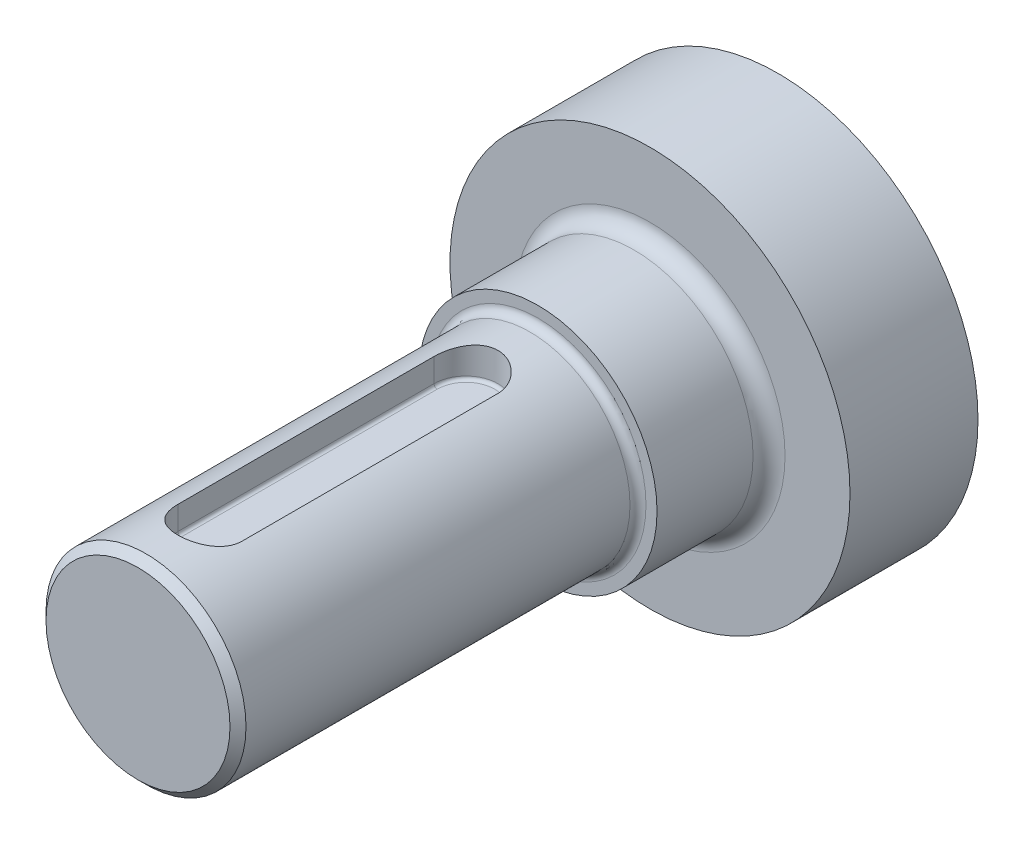
ISO-10303-21;
HEADER;
FILE_DESCRIPTION(('STEP AP214'),'2;1');
FILE_NAME('part.step','',(''),(''),'','','');
FILE_SCHEMA(('AUTOMOTIVE_DESIGN { 1 0 10303 214 1 1 1 1 }'));
ENDSEC;
DATA;
#1=APPLICATION_CONTEXT('core data for automotive mechanical design processes');
#2=APPLICATION_PROTOCOL_DEFINITION('international standard','automotive_design',2000,#1);
#3=PRODUCT_CONTEXT('',#1,'mechanical');
#4=PRODUCT('Part','Part','',(#3));
#5=PRODUCT_RELATED_PRODUCT_CATEGORY('part','',(#4));
#6=PRODUCT_DEFINITION_FORMATION('','',#4);
#7=PRODUCT_DEFINITION_CONTEXT('part definition',#1,'design');
#8=PRODUCT_DEFINITION('design','',#6,#7);
#9=PRODUCT_DEFINITION_SHAPE('','',#8);
#10=(LENGTH_UNIT() NAMED_UNIT(*) SI_UNIT(.MILLI.,.METRE.));
#11=(NAMED_UNIT(*) PLANE_ANGLE_UNIT() SI_UNIT($,.RADIAN.));
#12=(NAMED_UNIT(*) SI_UNIT($,.STERADIAN.) SOLID_ANGLE_UNIT());
#13=UNCERTAINTY_MEASURE_WITH_UNIT(LENGTH_MEASURE(1.E-05),#10,'distance_accuracy_value','');
#14=(GEOMETRIC_REPRESENTATION_CONTEXT(3) GLOBAL_UNCERTAINTY_ASSIGNED_CONTEXT((#13)) GLOBAL_UNIT_ASSIGNED_CONTEXT((#10,
#11,#12)) REPRESENTATION_CONTEXT('',''));
#15=CARTESIAN_POINT('',(0.,0.,0.));
#16=DIRECTION('',(0.,0.,1.));
#17=DIRECTION('',(1.,0.,0.));
#18=AXIS2_PLACEMENT_3D('',#15,#16,#17);
#19=CARTESIAN_POINT('',(0.,0.,-30.));
#20=DIRECTION('',(0.,0.,1.));
#21=DIRECTION('',(1.,0.,0.));
#22=AXIS2_PLACEMENT_3D('',#19,#20,#21);
#23=PLANE('',#22);
#24=CARTESIAN_POINT('',(0.,0.,-30.));
#25=DIRECTION('',(0.,0.,1.));
#26=DIRECTION('',(1.,0.,0.));
#27=AXIS2_PLACEMENT_3D('',#24,#25,#26);
#28=CIRCLE('',#27,25.);
#29=CARTESIAN_POINT('',(25.,0.,-30.));
#30=VERTEX_POINT('',#29);
#31=EDGE_CURVE('E19',#30,#30,#28,.T.);
#32=ORIENTED_EDGE('',*,*,#31,.F.);
#33=EDGE_LOOP('',(#32));
#34=FACE_BOUND('',#33,.T.);
#35=ADVANCED_FACE('F15',(#34),#23,.F.);
#36=CARTESIAN_POINT('',(0.,0.,-30.));
#37=DIRECTION('',(0.,0.,1.));
#38=DIRECTION('',(1.,0.,0.));
#39=AXIS2_PLACEMENT_3D('',#36,#37,#38);
#40=CYLINDRICAL_SURFACE('',#39,25.);
#41=ORIENTED_EDGE('',*,*,#31,.T.);
#42=EDGE_LOOP('',(#41));
#43=FACE_BOUND('',#42,.T.);
#44=CARTESIAN_POINT('',(0.,0.,-14.));
#45=DIRECTION('',(0.,0.,1.));
#46=DIRECTION('',(1.,0.,0.));
#47=AXIS2_PLACEMENT_3D('',#44,#45,#46);
#48=CIRCLE('',#47,25.);
#49=CARTESIAN_POINT('',(25.,0.,-14.));
#50=VERTEX_POINT('',#49);
#51=EDGE_CURVE('E198',#50,#50,#48,.T.);
#52=ORIENTED_EDGE('',*,*,#51,.F.);
#53=EDGE_LOOP('',(#52));
#54=FACE_BOUND('',#53,.T.);
#55=ADVANCED_FACE('F213',(#43,#54),#40,.T.);
#56=CARTESIAN_POINT('',(0.,0.,-14.));
#57=DIRECTION('',(0.,0.,1.));
#58=DIRECTION('',(1.,0.,0.));
#59=AXIS2_PLACEMENT_3D('',#56,#57,#58);
#60=PLANE('',#59);
#61=ORIENTED_EDGE('',*,*,#51,.T.);
#62=EDGE_LOOP('',(#61));
#63=FACE_BOUND('',#62,.T.);
#64=CARTESIAN_POINT('',(0.,0.,-14.));
#65=DIRECTION('',(0.,0.,1.));
#66=DIRECTION('',(1.,0.,0.));
#67=AXIS2_PLACEMENT_3D('',#64,#65,#66);
#68=CIRCLE('',#67,16.88);
#69=CARTESIAN_POINT('',(16.88,0.,-14.));
#70=VERTEX_POINT('',#69);
#71=EDGE_CURVE('E195',#70,#70,#68,.F.);
#72=ORIENTED_EDGE('',*,*,#71,.T.);
#73=EDGE_LOOP('',(#72));
#74=FACE_BOUND('',#73,.T.);
#75=ADVANCED_FACE('F221',(#63,#74),#60,.T.);
#76=CARTESIAN_POINT('',(0.,0.,-12.));
#77=DIRECTION('',(0.,0.,1.));
#78=DIRECTION('',(1.,0.,0.));
#79=AXIS2_PLACEMENT_3D('',#76,#77,#78);
#80=TOROIDAL_SURFACE('',#79,16.88,2.);
#81=CARTESIAN_POINT('',(0.,0.,-12.));
#82=DIRECTION('',(0.,0.,1.));
#83=DIRECTION('',(1.,0.,0.));
#84=AXIS2_PLACEMENT_3D('',#81,#82,#83);
#85=CIRCLE('',#84,14.88);
#86=CARTESIAN_POINT('',(14.88,0.,-12.));
#87=VERTEX_POINT('',#86);
#88=EDGE_CURVE('E191',#87,#87,#85,.T.);
#89=ORIENTED_EDGE('',*,*,#88,.F.);
#90=EDGE_LOOP('',(#89));
#91=FACE_BOUND('',#90,.T.);
#92=ORIENTED_EDGE('',*,*,#71,.F.);
#93=EDGE_LOOP('',(#92));
#94=FACE_BOUND('',#93,.T.);
#95=ADVANCED_FACE('F342',(#91,#94),#80,.F.);
#96=CARTESIAN_POINT('',(0.,0.,-14.));
#97=DIRECTION('',(0.,0.,1.));
#98=DIRECTION('',(1.,0.,0.));
#99=AXIS2_PLACEMENT_3D('',#96,#97,#98);
#100=CYLINDRICAL_SURFACE('',#99,14.88);
#101=CARTESIAN_POINT('',(0.,0.,0.));
#102=DIRECTION('',(0.,0.,1.));
#103=DIRECTION('',(1.,0.,0.));
#104=AXIS2_PLACEMENT_3D('',#101,#102,#103);
#105=CIRCLE('',#104,14.88);
#106=CARTESIAN_POINT('',(14.88,0.,0.));
#107=VERTEX_POINT('',#106);
#108=EDGE_CURVE('E187',#107,#107,#105,.T.);
#109=ORIENTED_EDGE('',*,*,#108,.F.);
#110=EDGE_LOOP('',(#109));
#111=FACE_BOUND('',#110,.T.);
#112=ORIENTED_EDGE('',*,*,#88,.T.);
#113=EDGE_LOOP('',(#112));
#114=FACE_BOUND('',#113,.T.);
#115=ADVANCED_FACE('F333',(#111,#114),#100,.T.);
#116=CARTESIAN_POINT('',(0.,0.,0.));
#117=DIRECTION('',(0.,0.,1.));
#118=DIRECTION('',(1.,0.,0.));
#119=AXIS2_PLACEMENT_3D('',#116,#117,#118);
#120=PLANE('',#119);
#121=ORIENTED_EDGE('',*,*,#108,.T.);
#122=EDGE_LOOP('',(#121));
#123=FACE_BOUND('',#122,.T.);
#124=CARTESIAN_POINT('',(0.,0.,0.));
#125=DIRECTION('',(0.,0.,-1.));
#126=DIRECTION('',(-1.,0.,0.));
#127=AXIS2_PLACEMENT_3D('',#124,#125,#126);
#128=CIRCLE('',#127,13.5);
#129=CARTESIAN_POINT('',(-13.5,0.,0.));
#130=VERTEX_POINT('',#129);
#131=EDGE_CURVE('E161',#130,#130,#128,.T.);
#132=ORIENTED_EDGE('',*,*,#131,.T.);
#133=EDGE_LOOP('',(#132));
#134=FACE_BOUND('',#133,.T.);
#135=ADVANCED_FACE('F324',(#123,#134),#120,.T.);
#136=CARTESIAN_POINT('',(0.,0.,50.));
#137=DIRECTION('',(0.,0.,1.));
#138=DIRECTION('',(1.,0.,0.));
#139=AXIS2_PLACEMENT_3D('',#136,#137,#138);
#140=PLANE('',#139);
#141=CARTESIAN_POINT('',(0.,0.,50.0000000000005));
#142=DIRECTION('',(0.,0.,-1.));
#143=DIRECTION('',(-1.,0.,0.));
#144=AXIS2_PLACEMENT_3D('',#141,#142,#143);
#145=CIRCLE('',#144,11.5000000000004);
#146=CARTESIAN_POINT('',(-11.5000000000004,0.,50.0000000000005));
#147=VERTEX_POINT('',#146);
#148=EDGE_CURVE('E157',#147,#147,#145,.T.);
#149=ORIENTED_EDGE('',*,*,#148,.F.);
#150=EDGE_LOOP('',(#149));
#151=FACE_BOUND('',#150,.T.);
#152=ADVANCED_FACE('F315',(#151),#140,.T.);
#153=CARTESIAN_POINT('',(3.6,8.9,41.));
#154=DIRECTION('',(0.,0.,-1.));
#155=DIRECTION('',(1.,0.,0.));
#156=AXIS2_PLACEMENT_3D('',#153,#154,#155);
#157=CYLINDRICAL_SURFACE('',#156,0.4);
#158=CARTESIAN_POINT('',(3.6,8.9,9.));
#159=DIRECTION('',(0.,0.,-1.));
#160=DIRECTION('',(-1.,0.,0.));
#161=AXIS2_PLACEMENT_3D('',#158,#159,#160);
#162=CIRCLE('',#161,0.4);
#163=CARTESIAN_POINT('',(4.,8.9,9.));
#164=VERTEX_POINT('',#163);
#165=CARTESIAN_POINT('',(3.6,8.5,9.));
#166=VERTEX_POINT('',#165);
#167=EDGE_CURVE('E165',#164,#166,#162,.T.);
#168=ORIENTED_EDGE('',*,*,#167,.T.);
#169=DIRECTION('',(0.,0.,-1.));
#170=VECTOR('',#169,1.);
#171=CARTESIAN_POINT('',(3.6,8.5,41.));
#172=LINE('',#171,#170);
#173=CARTESIAN_POINT('',(3.6,8.5,41.));
#174=VERTEX_POINT('',#173);
#175=EDGE_CURVE('E176',#166,#174,#172,.F.);
#176=ORIENTED_EDGE('',*,*,#175,.T.);
#177=CARTESIAN_POINT('',(3.6,8.9,41.));
#178=DIRECTION('',(0.,0.,-1.));
#179=DIRECTION('',(-1.,0.,0.));
#180=AXIS2_PLACEMENT_3D('',#177,#178,#179);
#181=CIRCLE('',#180,0.4);
#182=CARTESIAN_POINT('',(4.,8.9,41.));
#183=VERTEX_POINT('',#182);
#184=EDGE_CURVE('E180',#174,#183,#181,.F.);
#185=ORIENTED_EDGE('',*,*,#184,.T.);
#186=DIRECTION('',(0.,0.,-1.));
#187=VECTOR('',#186,1.);
#188=CARTESIAN_POINT('',(4.,8.9,41.));
#189=LINE('',#188,#187);
#190=EDGE_CURVE('E154',#183,#164,#189,.T.);
#191=ORIENTED_EDGE('',*,*,#190,.T.);
#192=EDGE_LOOP('',(#168,#176,#185,#191));
#193=FACE_BOUND('',#192,.T.);
#194=ADVANCED_FACE('F306',(#193),#157,.F.);
#195=CARTESIAN_POINT('',(0.,8.9,41.));
#196=DIRECTION('',(0.,-1.,0.));
#197=DIRECTION('',(0.,0.,1.));
#198=AXIS2_PLACEMENT_3D('',#195,#196,#197);
#199=TOROIDAL_SURFACE('',#198,3.6,0.4);
#200=CARTESIAN_POINT('',(0.,8.9,41.));
#201=DIRECTION('',(0.,-1.,0.));
#202=DIRECTION('',(0.,0.,-1.));
#203=AXIS2_PLACEMENT_3D('',#200,#201,#202);
#204=CIRCLE('',#203,4.);
#205=CARTESIAN_POINT('',(-4.,8.9,41.));
#206=VERTEX_POINT('',#205);
#207=EDGE_CURVE('E67',#206,#183,#204,.F.);
#208=ORIENTED_EDGE('',*,*,#207,.T.);
#209=ORIENTED_EDGE('',*,*,#184,.F.);
#210=CARTESIAN_POINT('',(0.,8.5,41.));
#211=DIRECTION('',(0.,-1.,0.));
#212=DIRECTION('',(0.,0.,-1.));
#213=AXIS2_PLACEMENT_3D('',#210,#211,#212);
#214=CIRCLE('',#213,3.6);
#215=CARTESIAN_POINT('',(-3.6,8.5,41.));
#216=VERTEX_POINT('',#215);
#217=EDGE_CURVE('E172',#174,#216,#214,.T.);
#218=ORIENTED_EDGE('',*,*,#217,.T.);
#219=CARTESIAN_POINT('',(-3.6,8.9,41.));
#220=DIRECTION('',(0.,0.,1.));
#221=DIRECTION('',(1.,0.,0.));
#222=AXIS2_PLACEMENT_3D('',#219,#220,#221);
#223=CIRCLE('',#222,0.4);
#224=EDGE_CURVE('E183',#206,#216,#223,.T.);
#225=ORIENTED_EDGE('',*,*,#224,.F.);
#226=EDGE_LOOP('',(#208,#209,#218,#225));
#227=FACE_BOUND('',#226,.T.);
#228=ADVANCED_FACE('F297',(#227),#199,.F.);
#229=CARTESIAN_POINT('',(0.,8.5,25.11275126083));
#230=DIRECTION('',(0.,-1.,0.));
#231=DIRECTION('',(0.,0.,-1.));
#232=AXIS2_PLACEMENT_3D('',#229,#230,#231);
#233=PLANE('',#232);
#234=ORIENTED_EDGE('',*,*,#217,.F.);
#235=ORIENTED_EDGE('',*,*,#175,.F.);
#236=CARTESIAN_POINT('',(0.,8.5,9.));
#237=DIRECTION('',(0.,-1.,0.));
#238=DIRECTION('',(0.,0.,-1.));
#239=AXIS2_PLACEMENT_3D('',#236,#237,#238);
#240=CIRCLE('',#239,3.6);
#241=CARTESIAN_POINT('',(-3.6,8.5,9.));
#242=VERTEX_POINT('',#241);
#243=EDGE_CURVE('E169',#166,#242,#240,.F.);
#244=ORIENTED_EDGE('',*,*,#243,.T.);
#245=DIRECTION('',(0.,0.,-1.));
#246=VECTOR('',#245,1.);
#247=CARTESIAN_POINT('',(-3.6,8.5,25.11275126083));
#248=LINE('',#247,#246);
#249=EDGE_CURVE('E141',#242,#216,#248,.F.);
#250=ORIENTED_EDGE('',*,*,#249,.T.);
#251=EDGE_LOOP('',(#234,#235,#244,#250));
#252=FACE_BOUND('',#251,.T.);
#253=ADVANCED_FACE('F288',(#252),#233,.F.);
#254=CARTESIAN_POINT('',(0.,8.9,9.));
#255=DIRECTION('',(0.,-1.,0.));
#256=DIRECTION('',(1.,0.,0.));
#257=AXIS2_PLACEMENT_3D('',#254,#255,#256);
#258=TOROIDAL_SURFACE('',#257,3.6,0.4);
#259=CARTESIAN_POINT('',(0.,8.9,9.));
#260=DIRECTION('',(0.,-1.,0.));
#261=DIRECTION('',(0.,0.,-1.));
#262=AXIS2_PLACEMENT_3D('',#259,#260,#261);
#263=CIRCLE('',#262,4.);
#264=CARTESIAN_POINT('',(-4.,8.9,8.99999999999999));
#265=VERTEX_POINT('',#264);
#266=EDGE_CURVE('E134',#164,#265,#263,.F.);
#267=ORIENTED_EDGE('',*,*,#266,.T.);
#268=CARTESIAN_POINT('',(-3.6,8.9,8.99999999999999));
#269=DIRECTION('',(0.,0.,1.));
#270=DIRECTION('',(1.,0.,0.));
#271=AXIS2_PLACEMENT_3D('',#268,#269,#270);
#272=CIRCLE('',#271,0.4);
#273=EDGE_CURVE('E145',#265,#242,#272,.T.);
#274=ORIENTED_EDGE('',*,*,#273,.T.);
#275=ORIENTED_EDGE('',*,*,#243,.F.);
#276=ORIENTED_EDGE('',*,*,#167,.F.);
#277=EDGE_LOOP('',(#267,#274,#275,#276));
#278=FACE_BOUND('',#277,.T.);
#279=ADVANCED_FACE('F279',(#278),#258,.F.);
#280=CARTESIAN_POINT('',(0.,0.,1.));
#281=DIRECTION('',(0.,0.,-1.));
#282=DIRECTION('',(1.,0.,0.));
#283=AXIS2_PLACEMENT_3D('',#280,#281,#282);
#284=TOROIDAL_SURFACE('',#283,13.5,1.);
#285=ORIENTED_EDGE('',*,*,#131,.F.);
#286=EDGE_LOOP('',(#285));
#287=FACE_BOUND('',#286,.T.);
#288=CARTESIAN_POINT('',(0.,0.,1.));
#289=DIRECTION('',(0.,0.,1.));
#290=DIRECTION('',(1.,0.,0.));
#291=AXIS2_PLACEMENT_3D('',#288,#289,#290);
#292=CIRCLE('',#291,12.5);
#293=CARTESIAN_POINT('',(12.5,0.,1.));
#294=VERTEX_POINT('',#293);
#295=EDGE_CURVE('E130',#294,#294,#292,.T.);
#296=ORIENTED_EDGE('',*,*,#295,.F.);
#297=EDGE_LOOP('',(#296));
#298=FACE_BOUND('',#297,.T.);
#299=ADVANCED_FACE('F270',(#287,#298),#284,.F.);
#300=CARTESIAN_POINT('',(0.,0.,49.));
#301=DIRECTION('',(0.,0.,-1.));
#302=DIRECTION('',(1.,0.,0.));
#303=AXIS2_PLACEMENT_3D('',#300,#301,#302);
#304=CONICAL_SURFACE('',#303,12.5,0.785398163397);
#305=CARTESIAN_POINT('',(0.,0.,49.));
#306=DIRECTION('',(0.,0.,1.));
#307=DIRECTION('',(1.,0.,0.));
#308=AXIS2_PLACEMENT_3D('',#305,#306,#307);
#309=CIRCLE('',#308,12.5);
#310=CARTESIAN_POINT('',(12.5,0.,49.));
#311=VERTEX_POINT('',#310);
#312=EDGE_CURVE('E126',#311,#311,#309,.F.);
#313=ORIENTED_EDGE('',*,*,#312,.F.);
#314=EDGE_LOOP('',(#313));
#315=FACE_BOUND('',#314,.T.);
#316=ORIENTED_EDGE('',*,*,#148,.T.);
#317=EDGE_LOOP('',(#316));
#318=FACE_BOUND('',#317,.T.);
#319=ADVANCED_FACE('F262',(#315,#318),#304,.T.);
#320=CARTESIAN_POINT('',(4.,8.5,9.));
#321=DIRECTION('',(1.,0.,0.));
#322=DIRECTION('',(0.,1.,0.));
#323=AXIS2_PLACEMENT_3D('',#320,#321,#322);
#324=PLANE('',#323);
#325=DIRECTION('',(0.,1.,0.));
#326=VECTOR('',#325,1.);
#327=CARTESIAN_POINT('',(4.,8.5,9.));
#328=LINE('',#327,#326);
#329=CARTESIAN_POINT('',(4.,11.842719282327,9.));
#330=VERTEX_POINT('',#329);
#331=EDGE_CURVE('E137',#330,#164,#328,.F.);
#332=ORIENTED_EDGE('',*,*,#331,.T.);
#333=ORIENTED_EDGE('',*,*,#190,.F.);
#334=DIRECTION('',(0.,1.,0.));
#335=VECTOR('',#334,1.);
#336=CARTESIAN_POINT('',(4.,8.5,41.));
#337=LINE('',#336,#335);
#338=CARTESIAN_POINT('',(4.,11.842719282327,41.));
#339=VERTEX_POINT('',#338);
#340=EDGE_CURVE('E149',#183,#339,#337,.T.);
#341=ORIENTED_EDGE('',*,*,#340,.T.);
#342=DIRECTION('',(0.,0.,1.));
#343=VECTOR('',#342,1.);
#344=CARTESIAN_POINT('',(4.00000000000001,11.842719282327,0.));
#345=LINE('',#344,#343);
#346=EDGE_CURVE('E86',#330,#339,#345,.T.);
#347=ORIENTED_EDGE('',*,*,#346,.F.);
#348=EDGE_LOOP('',(#332,#333,#341,#347));
#349=FACE_BOUND('',#348,.T.);
#350=ADVANCED_FACE('F255',(#349),#324,.F.);
#351=CARTESIAN_POINT('',(0.,8.5,41.));
#352=DIRECTION('',(0.,1.,0.));
#353=DIRECTION('',(0.,0.,1.));
#354=AXIS2_PLACEMENT_3D('',#351,#352,#353);
#355=CYLINDRICAL_SURFACE('',#354,4.);
#356=CARTESIAN_POINT('',(4.,11.842719282327,41.));
#357=CARTESIAN_POINT('',(4.00001410553509,11.8427027365885,41.1093998402906));
#358=CARTESIAN_POINT('',(3.99551216991836,11.8442348071428,41.2187903465591));
#359=CARTESIAN_POINT('',(3.97758603844806,11.8502731004644,41.4367285129362));
#360=CARTESIAN_POINT('',(3.96416408328824,11.8547785763155,41.5452763777891));
#361=CARTESIAN_POINT('',(3.9285571848402,11.8666242298361,41.7604613672992));
#362=CARTESIAN_POINT('',(3.90639670097638,11.8739564939659,41.8671029641123));
#363=CARTESIAN_POINT('',(3.85353577346109,11.8912165119513,42.0780057714635));
#364=CARTESIAN_POINT('',(3.82283505698322,11.9011443487245,42.1822669058402));
#365=CARTESIAN_POINT('',(3.71831661615006,11.9343844175302,42.490308085102));
#366=CARTESIAN_POINT('',(3.63203294168104,11.9611707903907,42.689642534924));
#367=CARTESIAN_POINT('',(3.42894659598282,12.0209593880824,43.0710180558689));
#368=CARTESIAN_POINT('',(3.31212796271801,12.0539648613987,43.2530500141108));
#369=CARTESIAN_POINT('',(3.04679752532161,12.1237952373799,43.601238114007));
#370=CARTESIAN_POINT('',(2.89738125713571,12.1607092582287,43.7666885176218));
#371=CARTESIAN_POINT('',(2.57299445071317,12.2334496666857,44.0706901431211));
#372=CARTESIAN_POINT('',(2.39801491874926,12.2692756661233,44.2092318578012));
#373=CARTESIAN_POINT('',(2.02228593226888,12.3368406393607,44.4586740522231));
#374=CARTESIAN_POINT('',(1.82101483541547,12.3684595626705,44.5688235148352));
#375=CARTESIAN_POINT('',(1.40174490462758,12.4229466111708,44.7533223401268));
#376=CARTESIAN_POINT('',(1.18376689598024,12.4458254246448,44.827715458196));
#377=CARTESIAN_POINT('',(0.804007839337554,12.4751110798498,44.9216954629966));
#378=CARTESIAN_POINT('',(0.644786410246608,12.4843928615952,44.9510009067408));
#379=CARTESIAN_POINT('',(0.323730318506224,12.4968396009453,44.9901561466465));
#380=CARTESIAN_POINT('',(0.161895779375894,12.5000048468239,45.0000068597152));
#381=CARTESIAN_POINT('',(-0.21860409355479,12.4999934554468,44.9999907374866));
#382=CARTESIAN_POINT('',(-0.437319843208506,12.4942070486291,44.9820086841751));
#383=CARTESIAN_POINT('',(-0.868437175373143,12.4716696397814,44.9107093988205));
#384=CARTESIAN_POINT('',(-1.08083310557251,12.4549091136673,44.8573614733761));
#385=CARTESIAN_POINT('',(-1.49288014873251,12.4122579980379,44.7173332568274));
#386=CARTESIAN_POINT('',(-1.69255442164985,12.3863845941082,44.6307156798866));
#387=CARTESIAN_POINT('',(-2.07451801615567,12.3281691193909,44.426845177215));
#388=CARTESIAN_POINT('',(-2.25680624249481,12.2958266414752,44.3095903231995));
#389=CARTESIAN_POINT('',(-2.60473162094863,12.2269276296913,44.0437937275049));
#390=CARTESIAN_POINT('',(-2.76973082583319,12.1902759371185,43.8944416940714));
#391=CARTESIAN_POINT('',(-3.07282811013101,12.1174287085,43.570400946535));
#392=CARTESIAN_POINT('',(-3.21091937022886,12.0812332902568,43.3957058292194));
#393=CARTESIAN_POINT('',(-3.45982736996761,12.0123582119337,43.020307329321));
#394=CARTESIAN_POINT('',(-3.56982627302902,11.9797968372488,42.8190383342338));
#395=CARTESIAN_POINT('',(-3.7540759327156,11.9233505767665,42.3997279913226));
#396=CARTESIAN_POINT('',(-3.82836090970701,11.899457390695,42.1817029321467));
#397=CARTESIAN_POINT('',(-3.92204964526393,11.8688299195566,41.802190151234));
#398=CARTESIAN_POINT('',(-3.95122403806462,11.859100566357,41.6433057066717));
#399=CARTESIAN_POINT('',(-3.9804570036979,11.8493063109057,41.4030828219281));
#400=CARTESIAN_POINT('',(-3.98777989651833,11.8468415118708,41.3226801718911));
#401=CARTESIAN_POINT('',(-3.99755330748323,11.8435458554942,41.1615239418035));
#402=CARTESIAN_POINT('',(-4.00000248763501,11.8427154468466,41.0807702714826));
#403=CARTESIAN_POINT('',(-4.,11.842719282327,41.));
#404=B_SPLINE_CURVE_WITH_KNOTS('',3,(#356,#357,#358,#359,#360,#361,#362,#363,#364,#365,#366,
#367,#368,#369,#370,#371,#372,#373,#374,#375,#376,#377,#378,#379,#380,#381,#382,#383,#384,#385,
#386,#387,#388,#389,#390,#391,#392,#393,#394,#395,#396,#397,#398,#399,#400,#401,#402,#403),
.UNSPECIFIED.,.F.,.F.,(4,2,2,2,2,2,2,2,2,2,2,2,2,2,2,2,2,2,2,2,2,2,2,4),(0.,0.328080381891703,
0.656078381683234,0.983164747927088,1.31026156447758,1.96356274608195,2.61720612380623,
3.29203396484998,3.96709979972617,4.65852116618799,5.34909426565891,5.83435537494045,
6.31959361317514,6.97479948473236,7.63057474337575,8.28511986748705,8.93970619804833,
9.61331787280542,10.2871000404437,10.9787001712848,11.6696362974832,12.1538302633295,
12.3960005997249,12.638237410589),.UNSPECIFIED.);
#405=CARTESIAN_POINT('',(-4.,11.842719282327,41.));
#406=VERTEX_POINT('',#405);
#407=EDGE_CURVE('E73',#339,#406,#404,.T.);
#408=ORIENTED_EDGE('',*,*,#407,.F.);
#409=ORIENTED_EDGE('',*,*,#340,.F.);
#410=ORIENTED_EDGE('',*,*,#207,.F.);
#411=DIRECTION('',(0.,1.,0.));
#412=VECTOR('',#411,1.);
#413=CARTESIAN_POINT('',(-4.,8.5,41.));
#414=LINE('',#413,#412);
#415=EDGE_CURVE('E70',#406,#206,#414,.F.);
#416=ORIENTED_EDGE('',*,*,#415,.F.);
#417=EDGE_LOOP('',(#408,#409,#410,#416));
#418=FACE_BOUND('',#417,.T.);
#419=ADVANCED_FACE('F72',(#418),#355,.F.);
#420=CARTESIAN_POINT('',(-3.6,8.9,9.));
#421=DIRECTION('',(0.,0.,1.));
#422=DIRECTION('',(-1.,0.,0.));
#423=AXIS2_PLACEMENT_3D('',#420,#421,#422);
#424=CYLINDRICAL_SURFACE('',#423,0.4);
#425=ORIENTED_EDGE('',*,*,#224,.T.);
#426=ORIENTED_EDGE('',*,*,#249,.F.);
#427=ORIENTED_EDGE('',*,*,#273,.F.);
#428=DIRECTION('',(0.,0.,1.));
#429=VECTOR('',#428,1.);
#430=CARTESIAN_POINT('',(-4.,8.9,9.));
#431=LINE('',#430,#429);
#432=EDGE_CURVE('E78',#206,#265,#431,.F.);
#433=ORIENTED_EDGE('',*,*,#432,.F.);
#434=EDGE_LOOP('',(#425,#426,#427,#433));
#435=FACE_BOUND('',#434,.T.);
#436=ADVANCED_FACE('F241',(#435),#424,.F.);
#437=CARTESIAN_POINT('',(0.,8.5,9.));
#438=DIRECTION('',(0.,1.,0.));
#439=DIRECTION('',(0.,0.,1.));
#440=AXIS2_PLACEMENT_3D('',#437,#438,#439);
#441=CYLINDRICAL_SURFACE('',#440,4.);
#442=ORIENTED_EDGE('',*,*,#331,.F.);
#443=CARTESIAN_POINT('',(-4.,11.842719282327,9.));
#444=CARTESIAN_POINT('',(-4.00001410484613,11.8427027366058,8.8906002280384));
#445=CARTESIAN_POINT('',(-3.995512175201,11.8442348052368,8.7812097901521));
#446=CARTESIAN_POINT('',(-3.97758606678449,11.8502730910574,8.56327175926352));
#447=CARTESIAN_POINT('',(-3.96416412872571,11.8547785613244,8.4547239615155));
#448=CARTESIAN_POINT('',(-3.92855725119429,11.8666242076309,8.23953896915451));
#449=CARTESIAN_POINT('',(-3.9063967602145,11.8739564736691,8.13289730438877));
#450=CARTESIAN_POINT('',(-3.85353581488656,11.8912164993788,7.92199436162844));
#451=CARTESIAN_POINT('',(-3.82283508754056,11.90114434202,7.81773315984322));
#452=CARTESIAN_POINT('',(-3.71831764495512,11.9343840843196,7.50969499572164));
#453=CARTESIAN_POINT('',(-3.63203544139887,11.9611699822066,7.31036344793197));
#454=CARTESIAN_POINT('',(-3.42895021192288,12.0209583955878,6.92898744295816));
#455=CARTESIAN_POINT('',(-3.31213030924909,12.0539643457894,6.74695262095034));
#456=CARTESIAN_POINT('',(-3.0467850788479,12.123798407807,6.39874601140078));
#457=CARTESIAN_POINT('',(-2.89735303896514,12.1607158548651,6.23328167566053));
#458=CARTESIAN_POINT('',(-2.57296449846116,12.2334561140966,5.92928515141109));
#459=CARTESIAN_POINT('',(-2.39800356343232,12.2692787347869,5.79075765164231));
#460=CARTESIAN_POINT('',(-2.02237003010512,12.3368244653945,5.54138480162945));
#461=CARTESIAN_POINT('',(-1.82118394546976,12.3684294972003,5.43127804353036));
#462=CARTESIAN_POINT('',(-1.40197197350368,12.4229251649937,5.24675050465061));
#463=CARTESIAN_POINT('',(-1.18395091903581,12.4458182908278,5.1723195262181));
#464=CARTESIAN_POINT('',(-0.744713961063363,12.4796767811416,5.0636411357495));
#465=CARTESIAN_POINT('',(-0.523827920101154,12.4910030499338,5.02817506661988));
#466=CARTESIAN_POINT('',(-0.0789648151746367,12.5017287122873,4.99456720095836));
#467=CARTESIAN_POINT('',(0.145011564197642,12.5011307063103,4.99641726647516));
#468=CARTESIAN_POINT('',(0.581094974437692,12.4883236673358,5.03659882927133));
#469=CARTESIAN_POINT('',(0.793338226675238,12.4765355800409,5.07360776797881));
#470=CARTESIAN_POINT('',(1.2084232001272,12.443194578958,5.18088055160631));
#471=CARTESIAN_POINT('',(1.41126440871778,12.4216411334261,5.2511462074328));
#472=CARTESIAN_POINT('',(1.80478548808183,12.3706364987475,5.42375784223576));
#473=CARTESIAN_POINT('',(1.99528012693527,12.3410893067347,5.52649651986879));
#474=CARTESIAN_POINT('',(2.35673113106229,12.2771965403044,5.76082904904521));
#475=CARTESIAN_POINT('',(2.5276825327575,12.2428497517893,5.89243020640299));
#476=CARTESIAN_POINT('',(2.85304511528221,12.1712409097156,6.18744653129156));
#477=CARTESIAN_POINT('',(3.00641313381737,12.1339170352569,6.3519967025921));
#478=CARTESIAN_POINT('',(3.28377291775701,12.0618172896256,6.7049719000853));
#479=CARTESIAN_POINT('',(3.40775562728565,12.0270422062066,6.89340425883215));
#480=CARTESIAN_POINT('',(3.56958208232607,11.9796198433082,7.19137123774859));
#481=CARTESIAN_POINT('',(3.61975674493765,11.9645161845072,7.29399905924154));
#482=CARTESIAN_POINT('',(3.71123075156255,11.9364591580623,7.50340475275169));
#483=CARTESIAN_POINT('',(3.75253376401034,11.9235049021446,7.61018088778642));
#484=CARTESIAN_POINT('',(3.82585831579178,11.9001802342949,7.82701332789163));
#485=CARTESIAN_POINT('',(3.85788979915529,11.889807055759,7.93706597797312));
#486=CARTESIAN_POINT('',(3.91241790563964,11.8719756673203,8.1596951569476));
#487=CARTESIAN_POINT('',(3.93491889994975,11.8645161211931,8.27227050379743));
#488=CARTESIAN_POINT('',(3.96832908530803,11.8533815888388,8.48723924586099));
#489=CARTESIAN_POINT('',(3.9802038456482,11.8493925948395,8.5894674157946));
#490=CARTESIAN_POINT('',(3.99603937127681,11.8440568016292,8.79446107803331));
#491=CARTESIAN_POINT('',(4.00001099551563,11.8427063770563,8.89722563828053));
#492=CARTESIAN_POINT('',(4.,11.842719282327,9.));
#493=B_SPLINE_CURVE_WITH_KNOTS('',3,(#443,#444,#445,#446,#447,#448,#449,#450,#451,#452,#453,
#454,#455,#456,#457,#458,#459,#460,#461,#462,#463,#464,#465,#466,#467,#468,#469,#470,#471,#472,
#473,#474,#475,#476,#477,#478,#479,#480,#481,#482,#483,#484,#485,#486,#487,#488,#489,#490,#491,
#492),.UNSPECIFIED.,.F.,.F.,(4,2,2,2,2,2,2,2,2,2,2,2,2,2,2,2,2,2,2,2,2,2,2,2,4),(0.,
0.328080176984104,0.656077971124948,0.983164539368217,1.310261564488,1.96355293984248,
2.61720612481382,3.29209427898756,3.96709980211697,4.65819584662373,5.34909422856993,
6.01770820975085,6.68617638029994,7.3304550155383,7.97476873730064,8.6271932010581,
9.27978300073407,9.96076419384898,10.6419549776068,10.9872862883783,11.3324745283028,
11.6772911585126,12.0219494657669,12.3305938648259,12.6388138912331),.UNSPECIFIED.);
#494=CARTESIAN_POINT('',(-4.,11.842719282327,9.));
#495=VERTEX_POINT('',#494);
#496=EDGE_CURVE('E35',#495,#330,#493,.T.);
#497=ORIENTED_EDGE('',*,*,#496,.F.);
#498=DIRECTION('',(0.,1.,0.));
#499=VECTOR('',#498,1.);
#500=CARTESIAN_POINT('',(-4.,8.5,9.));
#501=LINE('',#500,#499);
#502=EDGE_CURVE('E26',#265,#495,#501,.T.);
#503=ORIENTED_EDGE('',*,*,#502,.F.);
#504=ORIENTED_EDGE('',*,*,#266,.F.);
#505=EDGE_LOOP('',(#442,#497,#503,#504));
#506=FACE_BOUND('',#505,.T.);
#507=ADVANCED_FACE('F116',(#506),#441,.F.);
#508=CARTESIAN_POINT('',(0.,0.,0.));
#509=DIRECTION('',(0.,0.,1.));
#510=DIRECTION('',(1.,0.,0.));
#511=AXIS2_PLACEMENT_3D('',#508,#509,#510);
#512=CYLINDRICAL_SURFACE('',#511,12.5);
#513=ORIENTED_EDGE('',*,*,#312,.T.);
#514=EDGE_LOOP('',(#513));
#515=FACE_BOUND('',#514,.T.);
#516=ORIENTED_EDGE('',*,*,#346,.T.);
#517=ORIENTED_EDGE('',*,*,#407,.T.);
#518=DIRECTION('',(0.,0.,1.));
#519=VECTOR('',#518,1.);
#520=CARTESIAN_POINT('',(-4.,11.842719282327,9.));
#521=LINE('',#520,#519);
#522=EDGE_CURVE('E9',#495,#406,#521,.T.);
#523=ORIENTED_EDGE('',*,*,#522,.F.);
#524=ORIENTED_EDGE('',*,*,#496,.T.);
#525=EDGE_LOOP('',(#516,#517,#523,#524));
#526=FACE_BOUND('',#525,.T.);
#527=ORIENTED_EDGE('',*,*,#295,.T.);
#528=EDGE_LOOP('',(#527));
#529=FACE_BOUND('',#528,.T.);
#530=ADVANCED_FACE('F82',(#515,#526,#529),#512,.T.);
#531=CARTESIAN_POINT('',(-4.,8.5,9.));
#532=DIRECTION('',(1.,0.,0.));
#533=DIRECTION('',(0.,1.,0.));
#534=AXIS2_PLACEMENT_3D('',#531,#532,#533);
#535=PLANE('',#534);
#536=ORIENTED_EDGE('',*,*,#502,.T.);
#537=ORIENTED_EDGE('',*,*,#522,.T.);
#538=ORIENTED_EDGE('',*,*,#415,.T.);
#539=ORIENTED_EDGE('',*,*,#432,.T.);
#540=EDGE_LOOP('',(#536,#537,#538,#539));
#541=FACE_BOUND('',#540,.T.);
#542=ADVANCED_FACE('F89',(#541),#535,.T.);
#543=CLOSED_SHELL('',(#35,#55,#75,#95,#115,#135,#152,#194,#228,#253,#279,#299,#319,#350,#419,
#436,#507,#530,#542));
#544=MANIFOLD_SOLID_BREP('B1',#543);
#545=ADVANCED_BREP_SHAPE_REPRESENTATION('',(#18,#544),#14);
#546=SHAPE_DEFINITION_REPRESENTATION(#9,#545);
ENDSEC;
END-ISO-10303-21;
